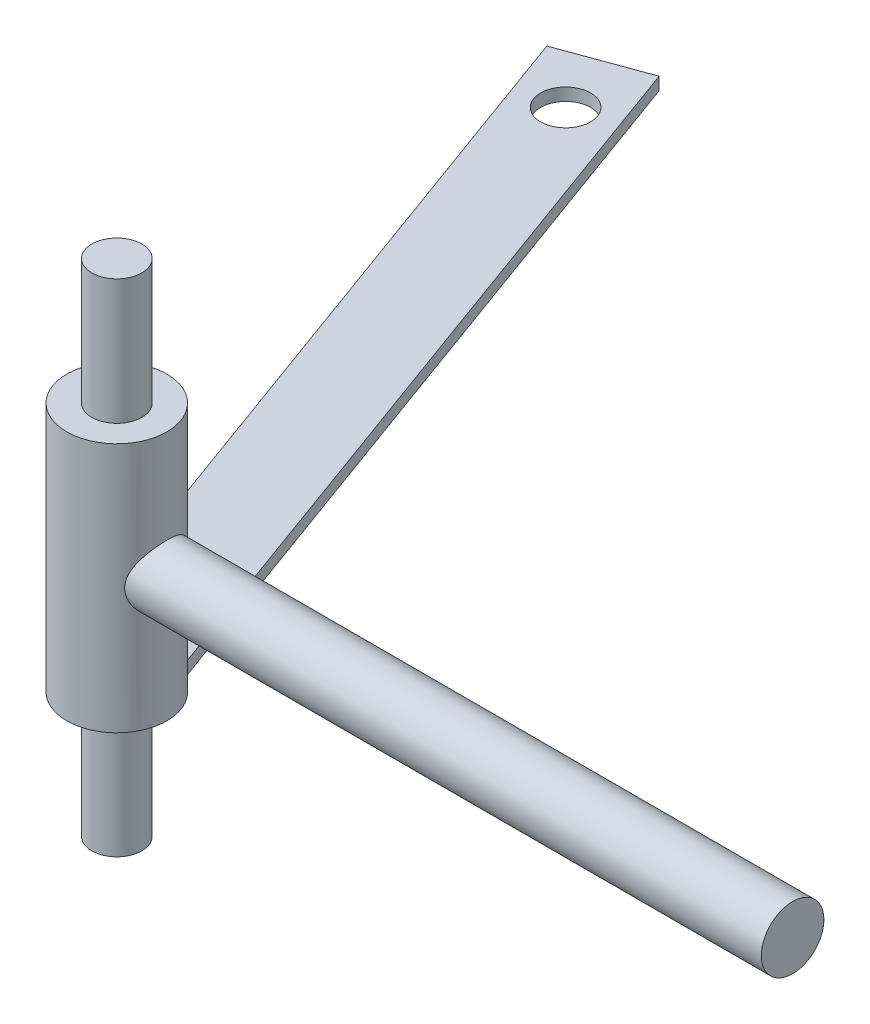
ISO-10303-21;
HEADER;
FILE_DESCRIPTION(('STEP AP214'),'2;1');
FILE_NAME('part.step','',(''),(''),'','','');
FILE_SCHEMA(('AUTOMOTIVE_DESIGN { 1 0 10303 214 1 1 1 1 }'));
ENDSEC;
DATA;
#1=APPLICATION_CONTEXT('core data for automotive mechanical design processes');
#2=APPLICATION_PROTOCOL_DEFINITION('international standard','automotive_design',2000,#1);
#3=PRODUCT_CONTEXT('',#1,'mechanical');
#4=PRODUCT('Part','Part','',(#3));
#5=PRODUCT_RELATED_PRODUCT_CATEGORY('part','',(#4));
#6=PRODUCT_DEFINITION_FORMATION('','',#4);
#7=PRODUCT_DEFINITION_CONTEXT('part definition',#1,'design');
#8=PRODUCT_DEFINITION('design','',#6,#7);
#9=PRODUCT_DEFINITION_SHAPE('','',#8);
#10=(LENGTH_UNIT() NAMED_UNIT(*) SI_UNIT(.MILLI.,.METRE.));
#11=(NAMED_UNIT(*) PLANE_ANGLE_UNIT() SI_UNIT($,.RADIAN.));
#12=(NAMED_UNIT(*) SI_UNIT($,.STERADIAN.) SOLID_ANGLE_UNIT());
#13=UNCERTAINTY_MEASURE_WITH_UNIT(LENGTH_MEASURE(1.E-05),#10,'distance_accuracy_value','');
#14=(GEOMETRIC_REPRESENTATION_CONTEXT(3) GLOBAL_UNCERTAINTY_ASSIGNED_CONTEXT((#13)) GLOBAL_UNIT_ASSIGNED_CONTEXT((#10,
#11,#12)) REPRESENTATION_CONTEXT('',''));
#15=CARTESIAN_POINT('',(0.,0.,0.));
#16=DIRECTION('',(0.,0.,1.));
#17=DIRECTION('',(1.,0.,0.));
#18=AXIS2_PLACEMENT_3D('',#15,#16,#17);
#19=CARTESIAN_POINT('',(0.,20.,0.));
#20=DIRECTION('',(0.,-1.,0.));
#21=DIRECTION('',(0.,0.,-1.));
#22=AXIS2_PLACEMENT_3D('',#19,#20,#21);
#23=CYLINDRICAL_SURFACE('',#22,8.);
#24=CARTESIAN_POINT('',(0.,-18.,0.));
#25=DIRECTION('',(0.,-1.,0.));
#26=DIRECTION('',(0.,0.,-1.));
#27=AXIS2_PLACEMENT_3D('',#24,#25,#26);
#28=CIRCLE('',#27,8.);
#29=CARTESIAN_POINT('',(-7.90248666466915,-18.,-1.24527286757814));
#30=VERTEX_POINT('',#29);
#31=CARTESIAN_POINT('',(5.25321002633356,-18.,-6.03355487413751));
#32=VERTEX_POINT('',#31);
#33=EDGE_CURVE('E51',#30,#32,#28,.T.);
#34=ORIENTED_EDGE('',*,*,#33,.T.);
#35=DIRECTION('',(0.,-1.,0.));
#36=VECTOR('',#35,1.);
#37=CARTESIAN_POINT('',(5.25321002633356,20.,-6.03355487413751));
#38=LINE('',#37,#36);
#39=CARTESIAN_POINT('',(5.25321002633356,-16.,-6.03355487413751));
#40=VERTEX_POINT('',#39);
#41=EDGE_CURVE('E11',#32,#40,#38,.F.);
#42=ORIENTED_EDGE('',*,*,#41,.T.);
#43=CARTESIAN_POINT('',(0.,-16.,0.));
#44=DIRECTION('',(0.,1.,0.));
#45=DIRECTION('',(-1.,0.,0.));
#46=AXIS2_PLACEMENT_3D('',#43,#44,#45);
#47=CIRCLE('',#46,8.);
#48=CARTESIAN_POINT('',(-7.90248666466915,-16.,-1.24527286757812));
#49=VERTEX_POINT('',#48);
#50=EDGE_CURVE('E85',#40,#49,#47,.T.);
#51=ORIENTED_EDGE('',*,*,#50,.T.);
#52=DIRECTION('',(0.,-1.,0.));
#53=VECTOR('',#52,1.);
#54=CARTESIAN_POINT('',(-7.90248666466915,20.,-1.24527286757812));
#55=LINE('',#54,#53);
#56=EDGE_CURVE('E189',#49,#30,#55,.T.);
#57=ORIENTED_EDGE('',*,*,#56,.T.);
#58=EDGE_LOOP('',(#34,#42,#51,#57));
#59=FACE_BOUND('',#58,.T.);
#60=CARTESIAN_POINT('',(0.,20.,0.));
#61=DIRECTION('',(0.,1.,0.));
#62=DIRECTION('',(0.,0.,1.));
#63=AXIS2_PLACEMENT_3D('',#60,#61,#62);
#64=CIRCLE('',#63,8.);
#65=CARTESIAN_POINT('',(0.,20.,8.));
#66=VERTEX_POINT('',#65);
#67=EDGE_CURVE('E119',#66,#66,#64,.T.);
#68=ORIENTED_EDGE('',*,*,#67,.F.);
#69=EDGE_LOOP('',(#68));
#70=FACE_BOUND('',#69,.T.);
#71=CARTESIAN_POINT('',(0.,-20.,0.));
#72=DIRECTION('',(0.,1.,0.));
#73=DIRECTION('',(0.,0.,1.));
#74=AXIS2_PLACEMENT_3D('',#71,#72,#73);
#75=CIRCLE('',#74,8.);
#76=CARTESIAN_POINT('',(0.,-20.,8.));
#77=VERTEX_POINT('',#76);
#78=EDGE_CURVE('E118',#77,#77,#75,.T.);
#79=ORIENTED_EDGE('',*,*,#78,.T.);
#80=EDGE_LOOP('',(#79));
#81=FACE_BOUND('',#80,.T.);
#82=CARTESIAN_POINT('',(6.2449979983984,0.,5.));
#83=CARTESIAN_POINT('',(6.24499999083318,-0.124309997084916,4.99999874728376));
#84=CARTESIAN_POINT('',(6.24872594235153,-0.248643911922182,4.99535477639502));
#85=CARTESIAN_POINT('',(6.26346233698878,-0.49624234521784,4.97686385741702));
#86=CARTESIAN_POINT('',(6.27447707053879,-0.619506190474289,4.96301148892208));
#87=CARTESIAN_POINT('',(6.30332817855701,-0.864132894108489,4.92631685582622));
#88=CARTESIAN_POINT('',(6.32117831167981,-0.985491401070756,4.90345645667282));
#89=CARTESIAN_POINT('',(6.36295500797281,-1.22521846002732,4.84912073775945));
#90=CARTESIAN_POINT('',(6.38688460836052,-1.34358548492504,4.81764111134031));
#91=CARTESIAN_POINT('',(6.46598710467671,-1.69098285176997,4.7115563432738));
#92=CARTESIAN_POINT('',(6.52878844336903,-1.91472159134201,4.6249307188155));
#93=CARTESIAN_POINT('',(6.66732308206754,-2.34407629105235,4.42286683667302));
#94=CARTESIAN_POINT('',(6.74305673480881,-2.54969175663766,4.30742779304936));
#95=CARTESIAN_POINT('',(6.91118002626909,-2.9674414130167,4.03296948836377));
#96=CARTESIAN_POINT('',(7.00444112628932,-3.17674952950574,3.87018134056582));
#97=CARTESIAN_POINT('',(7.19012524520994,-3.5675602565304,3.51319765959103));
#98=CARTESIAN_POINT('',(7.28254746874407,-3.74903864049325,3.31897506071619));
#99=CARTESIAN_POINT('',(7.41988971846401,-4.00760626149244,2.99356128179164));
#100=CARTESIAN_POINT('',(7.46785190700925,-4.09554829341698,2.87212880091628));
#101=CARTESIAN_POINT('',(7.55971876275306,-4.2607595171728,2.62078661715024));
#102=CARTESIAN_POINT('',(7.60362512973126,-4.33803318685166,2.49088050482952));
#103=CARTESIAN_POINT('',(7.68611478127736,-4.48104536831486,2.22333771815377));
#104=CARTESIAN_POINT('',(7.72470066932016,-4.54678952615798,2.08570487145723));
#105=CARTESIAN_POINT('',(7.79539753077303,-4.66588913640084,1.80358193532003));
#106=CARTESIAN_POINT('',(7.82750968154027,-4.71924684175159,1.6590930986712));
#107=CARTESIAN_POINT('',(7.88132879110577,-4.8079574186921,1.37943032429723));
#108=CARTESIAN_POINT('',(7.90376135583819,-4.84458864196752,1.24480106420069));
#109=CARTESIAN_POINT('',(7.94191844310852,-4.90659427549434,0.972050692903698));
#110=CARTESIAN_POINT('',(7.95764407963578,-4.93197055516711,0.833930165626438));
#111=CARTESIAN_POINT('',(7.98191012055643,-4.97102838824165,0.555534462309618));
#112=CARTESIAN_POINT('',(7.9904564434862,-4.98471957483722,0.415261158337185));
#113=CARTESIAN_POINT('',(8.00011955525847,-5.00019508535282,0.133810084943768));
#114=CARTESIAN_POINT('',(8.00123719925945,-5.00198077978344,-0.00736757849820934));
#115=CARTESIAN_POINT('',(7.99636544353032,-4.99418306842006,-0.270239609899376));
#116=CARTESIAN_POINT('',(7.99131217584322,-4.9860972278415,-0.391999310072934));
#117=CARTESIAN_POINT('',(7.97573898833036,-4.96109950689231,-0.63429359230614));
#118=CARTESIAN_POINT('',(7.96521743178982,-4.94418498400023,-0.754827796543429));
#119=CARTESIAN_POINT('',(7.93894787928476,-4.90175195667388,-0.9937504162903));
#120=CARTESIAN_POINT('',(7.92320165200919,-4.8762363638823,-1.11213954368103));
#121=CARTESIAN_POINT('',(7.88683283084566,-4.81691536004192,-1.34607315554106));
#122=CARTESIAN_POINT('',(7.86620835217571,-4.78310674467799,-1.46161652141072));
#123=CARTESIAN_POINT('',(7.79753837345255,-4.66961406787293,-1.80341623892686));
#124=CARTESIAN_POINT('',(7.74273886956257,-4.57793007291278,-2.02447250488061));
#125=CARTESIAN_POINT('',(7.6194209119633,-4.36611560771666,-2.44811588786114));
#126=CARTESIAN_POINT('',(7.55089933332867,-4.24597865675437,-2.6506987826293));
#127=CARTESIAN_POINT('',(7.39573414184525,-3.96389668023518,-3.05883635403528));
#128=CARTESIAN_POINT('',(7.30789649394851,-3.79860933546551,-3.26162345770391));
#129=CARTESIAN_POINT('',(7.12780216070677,-3.43944259665051,-3.63842034253163));
#130=CARTESIAN_POINT('',(7.0355391870356,-3.24552165003414,-3.81238750882611));
#131=CARTESIAN_POINT('',(6.89398778931581,-2.92199806035766,-4.05999923159469));
#132=CARTESIAN_POINT('',(6.84343529038729,-2.80103153254676,-4.14440430037547));
#133=CARTESIAN_POINT('',(6.7450499014227,-2.5512511400869,-4.30267035241461));
#134=CARTESIAN_POINT('',(6.69721752335299,-2.42243580756731,-4.37652935467605));
#135=CARTESIAN_POINT('',(6.60608014442446,-2.15770926568204,-4.51291782494085));
#136=CARTESIAN_POINT('',(6.56276754252838,-2.02181056536115,-4.57546644816391));
#137=CARTESIAN_POINT('',(6.48238923774268,-1.74330768244433,-4.6886516739402));
#138=CARTESIAN_POINT('',(6.44532349757936,-1.60070353986484,-4.7392883475702));
#139=CARTESIAN_POINT('',(6.3879911088914,-1.34808415551627,-4.81614194168603));
#140=CARTESIAN_POINT('',(6.36587062744548,-1.23937010533179,-4.84527833481626));
#141=CARTESIAN_POINT('',(6.3267200135842,-1.01935900201234,-4.89628944573215));
#142=CARTESIAN_POINT('',(6.30968872571675,-0.908062541381968,-4.91816581196151));
#143=CARTESIAN_POINT('',(6.2813224765214,-0.683654493148006,-4.95434333722363));
#144=CARTESIAN_POINT('',(6.26998098512218,-0.570545140796211,-4.96865318123363));
#145=CARTESIAN_POINT('',(6.25339132178237,-0.343158274667134,-4.98951663397229));
#146=CARTESIAN_POINT('',(6.24814339794355,-0.228880713516906,-4.99606992689043));
#147=CARTESIAN_POINT('',(6.24394563972607,0.000213756327469843,-5.00131530513999));
#148=CARTESIAN_POINT('',(6.2450091194138,0.115031294285455,-4.99999077198392));
#149=CARTESIAN_POINT('',(6.25342323341975,0.34411058983996,-4.98946310366481));
#150=CARTESIAN_POINT('',(6.26077617711313,0.458372127783275,-4.98025707456074));
#151=CARTESIAN_POINT('',(6.28148941326477,0.685492435641885,-4.95410620951325));
#152=CARTESIAN_POINT('',(6.29485173090555,0.798350719467862,-4.9371587646522));
#153=CARTESIAN_POINT('',(6.32708655414446,1.02190368194708,-4.8957794498311));
#154=CARTESIAN_POINT('',(6.3459613393153,1.13259744525952,-4.87134448334739));
#155=CARTESIAN_POINT('',(6.40919739263554,1.45674114316006,-4.78821642821574));
#156=CARTESIAN_POINT('',(6.46057720915498,1.6662777271024,-4.71921780239627));
#157=CARTESIAN_POINT('',(6.57662484324882,2.07118631830434,-4.55609149726001));
#158=CARTESIAN_POINT('',(6.6412973751829,2.26655326684989,-4.46195489902188));
#159=CARTESIAN_POINT('',(6.79148506979738,2.67720575477837,-4.23062377482239));
#160=CARTESIAN_POINT('',(6.87862419429458,2.88920195195314,-4.08864375810928));
#161=CARTESIAN_POINT('',(7.05576916354209,3.28876845285956,-3.77473221644168));
#162=CARTESIAN_POINT('',(7.14577790264,3.47631305761312,-3.60276961587649));
#163=CARTESIAN_POINT('',(7.28444679190235,3.75109437385404,-3.30924585333197));
#164=CARTESIAN_POINT('',(7.3346230901993,3.84742308399405,-3.19677534649598));
#165=CARTESIAN_POINT('',(7.43214539316412,4.03023211498251,-2.96297696798608));
#166=CARTESIAN_POINT('',(7.47949245970999,4.11671614194503,-2.84165245789285));
#167=CARTESIAN_POINT('',(7.57009743381039,4.27912544276188,-2.59064393379972));
#168=CARTESIAN_POINT('',(7.61335451021155,4.35504857193848,-2.46095822963468));
#169=CARTESIAN_POINT('',(7.69452475176042,4.49544110368957,-2.19402109584822));
#170=CARTESIAN_POINT('',(7.73244126265916,4.55991768393769,-2.05677447863483));
#171=CARTESIAN_POINT('',(7.79976180045409,4.67313922374355,-1.78389488579443));
#172=CARTESIAN_POINT('',(7.82953658856128,4.72258893611767,-1.64864631402092));
#173=CARTESIAN_POINT('',(7.88249738910155,4.80988250173737,-1.37327166975237));
#174=CARTESIAN_POINT('',(7.90568721484267,4.84773307297854,-1.2331484731144));
#175=CARTESIAN_POINT('',(7.94476970960063,4.91121075887916,-0.949284871547718));
#176=CARTESIAN_POINT('',(7.96066874338032,4.93684853590452,-0.805547737630325));
#177=CARTESIAN_POINT('',(7.98468098207153,4.97547600812264,-0.515747890604359));
#178=CARTESIAN_POINT('',(7.99279547496114,4.98846779564148,-0.369685566273095));
#179=CARTESIAN_POINT('',(8.00036899836203,5.0005918204771,-0.0984542398463481));
#180=CARTESIAN_POINT('',(8.00093085905799,5.00148999709849,0.0266091901107878));
#181=CARTESIAN_POINT('',(7.99619997327325,4.99391869226614,0.276384426548502));
#182=CARTESIAN_POINT('',(7.99090543949389,4.98544635104714,0.401096114033592));
#183=CARTESIAN_POINT('',(7.97459103015405,4.95925462589747,0.649105048465708));
#184=CARTESIAN_POINT('',(7.96357367253312,4.9415393086947,0.772402893113274));
#185=CARTESIAN_POINT('',(7.93607401526798,4.89709863543925,1.01678782002796));
#186=CARTESIAN_POINT('',(7.91958960822669,4.87036980485838,1.13787403075122));
#187=CARTESIAN_POINT('',(7.88220417715129,4.80933512611737,1.3727696067634));
#188=CARTESIAN_POINT('',(7.86147899328625,4.77532902296419,1.486685097437));
#189=CARTESIAN_POINT('',(7.8157172820285,4.69961071566991,1.71105112688166));
#190=CARTESIAN_POINT('',(7.79067928081094,4.65789587685613,1.82150046585626));
#191=CARTESIAN_POINT('',(7.70981708144695,4.52179700785277,2.14674322952902));
#192=CARTESIAN_POINT('',(7.64821482975006,4.41641101660221,2.3556119089249));
#193=CARTESIAN_POINT('',(7.50700801995937,4.1673460340312,2.77466231937412));
#194=CARTESIAN_POINT('',(7.42619858107808,4.02082779517783,2.98273013480178));
#195=CARTESIAN_POINT('',(7.2573471375721,3.6996977630728,3.37285679634255));
#196=CARTESIAN_POINT('',(7.16929702745266,3.52505426989102,3.55488585185797));
#197=CARTESIAN_POINT('',(6.98001614835192,3.12352869133323,3.91489797533942));
#198=CARTESIAN_POINT('',(6.87871489286988,2.89274538552561,4.08851588919805));
#199=CARTESIAN_POINT('',(6.68699282488335,2.40144255795418,4.3950903074783));
#200=CARTESIAN_POINT('',(6.59656601160477,2.14093959230367,4.52806930044201));
#201=CARTESIAN_POINT('',(6.45719150743099,1.65432760274299,4.72397005512007));
#202=CARTESIAN_POINT('',(6.40349524541685,1.43325185965496,4.79586701428079));
#203=CARTESIAN_POINT('',(6.33898756748728,1.09324362690463,4.88041603953431));
#204=CARTESIAN_POINT('',(6.32016868842665,0.978627920072953,4.90470355408434));
#205=CARTESIAN_POINT('',(6.28849738412123,0.747193668970045,4.94524770814465));
#206=CARTESIAN_POINT('',(6.27564188891545,0.630376290428755,4.9615084801139));
#207=CARTESIAN_POINT('',(6.25906589814134,0.427895086979101,4.9823903295282));
#208=CARTESIAN_POINT('',(6.25380210027526,0.342553322442731,4.98898701036639));
#209=CARTESIAN_POINT('',(6.24676702410079,0.171478227136942,4.99779282932784));
#210=CARTESIAN_POINT('',(6.24499662408473,0.0857448033275004,5.00000086408101));
#211=CARTESIAN_POINT('',(6.2449979983984,0.,5.));
#212=B_SPLINE_CURVE_WITH_KNOTS('',3,(#82,#83,#84,#85,#86,#87,#88,#89,#90,#91,#92,#93,#94,#95,
#96,#97,#98,#99,#100,#101,#102,#103,#104,#105,#106,#107,#108,#109,#110,#111,#112,#113,#114,#115,
#116,#117,#118,#119,#120,#121,#122,#123,#124,#125,#126,#127,#128,#129,#130,#131,#132,#133,#134,
#135,#136,#137,#138,#139,#140,#141,#142,#143,#144,#145,#146,#147,#148,#149,#150,#151,#152,#153,
#154,#155,#156,#157,#158,#159,#160,#161,#162,#163,#164,#165,#166,#167,#168,#169,#170,#171,#172,
#173,#174,#175,#176,#177,#178,#179,#180,#181,#182,#183,#184,#185,#186,#187,#188,#189,#190,#191,
#192,#193,#194,#195,#196,#197,#198,#199,#200,#201,#202,#203,#204,#205,#206,#207,#208,#209,#210,
#211),.UNSPECIFIED.,.T.,.F.,(4,2,2,2,2,2,2,2,2,2,2,2,2,2,2,2,2,2,2,2,2,2,2,2,2,2,2,2,2,2,2,2,2,
2,2,2,2,2,2,2,2,2,2,2,2,2,2,2,2,2,2,2,2,2,2,2,2,2,2,2,2,2,2,2,4),(0.,0.372830631717394,
0.745880919988992,1.11968608457865,1.49367836553752,2.2343739724708,2.97508978546025,
3.81517657771247,4.65599058786117,5.1276972709508,5.59920535801266,6.0704818965238,
6.54167264805615,6.9650003716167,7.38825775501684,7.8111658669397,8.2340252946041,
8.59998197802636,8.96604825916241,9.33199074341863,9.69807484639391,10.4313641163756,
11.1648205684642,11.9895533165928,12.8154948839412,13.2827866246025,13.7501660272479,
14.2167463086997,14.6833238060682,15.0271003394338,15.3707987622619,15.7141018213498,
16.0574188576537,16.4014603870609,16.7456282964257,17.0899122787371,17.4343388350078,
18.1111129623981,18.7881275281776,19.5940378131019,20.4007884080993,20.8693475683427,
21.337729748067,21.8062069071061,22.2743892571628,22.7148894158782,23.1551339612148,
23.5949934439159,24.0347801378503,24.409509228706,24.7843527137741,25.1590314139736,
25.5338547106938,25.8954875601863,26.2572442370256,26.9801965139639,27.7781872367985,
28.5770837508034,29.4911341692987,30.4046778558642,31.1173375632652,31.472952845656,
31.8283848529182,32.0854860972178,32.3426519723746),.UNSPECIFIED.);
#213=CARTESIAN_POINT('',(6.2449979983984,0.,5.));
#214=VERTEX_POINT('',#213);
#215=EDGE_CURVE('E134',#214,#214,#212,.T.);
#216=ORIENTED_EDGE('',*,*,#215,.F.);
#217=EDGE_LOOP('',(#216));
#218=FACE_BOUND('',#217,.T.);
#219=ADVANCED_FACE('F43',(#59,#70,#81,#218),#23,.T.);
#220=CARTESIAN_POINT('',(0.,40.,0.));
#221=DIRECTION('',(0.,-1.,0.));
#222=DIRECTION('',(0.,0.,-1.));
#223=AXIS2_PLACEMENT_3D('',#220,#221,#222);
#224=CYLINDRICAL_SURFACE('',#223,4.);
#225=CARTESIAN_POINT('',(0.,20.,0.));
#226=DIRECTION('',(0.,1.,0.));
#227=DIRECTION('',(0.,0.,1.));
#228=AXIS2_PLACEMENT_3D('',#225,#226,#227);
#229=CIRCLE('',#228,4.);
#230=CARTESIAN_POINT('',(0.,20.,4.));
#231=VERTEX_POINT('',#230);
#232=EDGE_CURVE('E122',#231,#231,#229,.T.);
#233=ORIENTED_EDGE('',*,*,#232,.T.);
#234=EDGE_LOOP('',(#233));
#235=FACE_BOUND('',#234,.T.);
#236=CARTESIAN_POINT('',(0.,40.,0.));
#237=DIRECTION('',(0.,1.,0.));
#238=DIRECTION('',(0.,0.,1.));
#239=AXIS2_PLACEMENT_3D('',#236,#237,#238);
#240=CIRCLE('',#239,4.);
#241=CARTESIAN_POINT('',(0.,40.,4.));
#242=VERTEX_POINT('',#241);
#243=EDGE_CURVE('E125',#242,#242,#240,.T.);
#244=ORIENTED_EDGE('',*,*,#243,.F.);
#245=EDGE_LOOP('',(#244));
#246=FACE_BOUND('',#245,.T.);
#247=ADVANCED_FACE('F45',(#235,#246),#224,.T.);
#248=CARTESIAN_POINT('',(0.,40.,0.));
#249=DIRECTION('',(0.,1.,0.));
#250=DIRECTION('',(0.,0.,1.));
#251=AXIS2_PLACEMENT_3D('',#248,#249,#250);
#252=PLANE('',#251);
#253=ORIENTED_EDGE('',*,*,#243,.T.);
#254=EDGE_LOOP('',(#253));
#255=FACE_BOUND('',#254,.T.);
#256=ADVANCED_FACE('F160',(#255),#252,.T.);
#257=CARTESIAN_POINT('',(0.,20.,0.));
#258=DIRECTION('',(0.,1.,0.));
#259=DIRECTION('',(0.,0.,1.));
#260=AXIS2_PLACEMENT_3D('',#257,#258,#259);
#261=PLANE('',#260);
#262=ORIENTED_EDGE('',*,*,#232,.F.);
#263=EDGE_LOOP('',(#262));
#264=FACE_BOUND('',#263,.T.);
#265=ORIENTED_EDGE('',*,*,#67,.T.);
#266=EDGE_LOOP('',(#265));
#267=FACE_BOUND('',#266,.T.);
#268=ADVANCED_FACE('F157',(#264,#267),#261,.T.);
#269=CARTESIAN_POINT('',(0.,-20.,0.));
#270=DIRECTION('',(0.,1.,0.));
#271=DIRECTION('',(0.,0.,1.));
#272=AXIS2_PLACEMENT_3D('',#269,#270,#271);
#273=PLANE('',#272);
#274=CARTESIAN_POINT('',(0.,-20.,0.));
#275=DIRECTION('',(0.,1.,0.));
#276=DIRECTION('',(0.,0.,1.));
#277=AXIS2_PLACEMENT_3D('',#274,#275,#276);
#278=CIRCLE('',#277,4.);
#279=CARTESIAN_POINT('',(0.,-20.,4.));
#280=VERTEX_POINT('',#279);
#281=EDGE_CURVE('E128',#280,#280,#278,.T.);
#282=ORIENTED_EDGE('',*,*,#281,.T.);
#283=EDGE_LOOP('',(#282));
#284=FACE_BOUND('',#283,.T.);
#285=ORIENTED_EDGE('',*,*,#78,.F.);
#286=EDGE_LOOP('',(#285));
#287=FACE_BOUND('',#286,.T.);
#288=ADVANCED_FACE('F159',(#284,#287),#273,.F.);
#289=CARTESIAN_POINT('',(0.,-40.,0.));
#290=DIRECTION('',(0.,1.,0.));
#291=DIRECTION('',(0.,0.,1.));
#292=AXIS2_PLACEMENT_3D('',#289,#290,#291);
#293=PLANE('',#292);
#294=CARTESIAN_POINT('',(0.,-40.,0.));
#295=DIRECTION('',(0.,1.,0.));
#296=DIRECTION('',(0.,0.,1.));
#297=AXIS2_PLACEMENT_3D('',#294,#295,#296);
#298=CIRCLE('',#297,4.);
#299=CARTESIAN_POINT('',(0.,-40.,4.));
#300=VERTEX_POINT('',#299);
#301=EDGE_CURVE('E129',#300,#300,#298,.T.);
#302=ORIENTED_EDGE('',*,*,#301,.F.);
#303=EDGE_LOOP('',(#302));
#304=FACE_BOUND('',#303,.T.);
#305=ADVANCED_FACE('F163',(#304),#293,.F.);
#306=ORIENTED_EDGE('',*,*,#301,.T.);
#307=EDGE_LOOP('',(#306));
#308=FACE_BOUND('',#307,.T.);
#309=ORIENTED_EDGE('',*,*,#281,.F.);
#310=EDGE_LOOP('',(#309));
#311=FACE_BOUND('',#310,.T.);
#312=ADVANCED_FACE('F154',(#308,#311),#224,.T.);
#313=CARTESIAN_POINT('',(108.,0.,0.));
#314=DIRECTION('',(-1.,0.,0.));
#315=DIRECTION('',(0.,0.,1.));
#316=AXIS2_PLACEMENT_3D('',#313,#314,#315);
#317=CYLINDRICAL_SURFACE('',#316,5.);
#318=CARTESIAN_POINT('',(108.,0.,0.));
#319=DIRECTION('',(1.,0.,0.));
#320=DIRECTION('',(0.,0.,-1.));
#321=AXIS2_PLACEMENT_3D('',#318,#319,#320);
#322=CIRCLE('',#321,5.);
#323=CARTESIAN_POINT('',(108.,0.,-5.));
#324=VERTEX_POINT('',#323);
#325=EDGE_CURVE('E111',#324,#324,#322,.T.);
#326=ORIENTED_EDGE('',*,*,#325,.F.);
#327=EDGE_LOOP('',(#326));
#328=FACE_BOUND('',#327,.T.);
#329=ORIENTED_EDGE('',*,*,#215,.T.);
#330=EDGE_LOOP('',(#329));
#331=FACE_BOUND('',#330,.T.);
#332=ADVANCED_FACE('F148',(#328,#331),#317,.T.);
#333=CARTESIAN_POINT('',(108.,0.,0.));
#334=DIRECTION('',(1.,0.,0.));
#335=DIRECTION('',(0.,0.,-1.));
#336=AXIS2_PLACEMENT_3D('',#333,#334,#335);
#337=PLANE('',#336);
#338=ORIENTED_EDGE('',*,*,#325,.T.);
#339=EDGE_LOOP('',(#338));
#340=FACE_BOUND('',#339,.T.);
#341=ADVANCED_FACE('F153',(#340),#337,.T.);
#342=CARTESIAN_POINT('',(-37.8847702868357,-16.,-124.554181705448));
#343=DIRECTION('',(0.939692620785908,0.,-0.342020143325669));
#344=DIRECTION('',(-0.342020143325669,0.,-0.939692620785908));
#345=AXIS2_PLACEMENT_3D('',#342,#343,#344);
#346=PLANE('',#345);
#347=ORIENTED_EDGE('',*,*,#41,.F.);
#348=DIRECTION('',(0.342020143325669,0.,0.939692620785908));
#349=VECTOR('',#348,1.);
#350=CARTESIAN_POINT('',(-37.8847702868357,-18.,-124.554181705448));
#351=LINE('',#350,#349);
#352=CARTESIAN_POINT('',(-37.8847702868357,-18.,-124.554181705448));
#353=VERTEX_POINT('',#352);
#354=EDGE_CURVE('E100',#353,#32,#351,.T.);
#355=ORIENTED_EDGE('',*,*,#354,.F.);
#356=DIRECTION('',(0.,1.,0.));
#357=VECTOR('',#356,1.);
#358=CARTESIAN_POINT('',(-37.8847702868357,-16.,-124.554181705448));
#359=LINE('',#358,#357);
#360=CARTESIAN_POINT('',(-37.8847702868357,-16.,-124.554181705448));
#361=VERTEX_POINT('',#360);
#362=EDGE_CURVE('E94',#353,#361,#359,.T.);
#363=ORIENTED_EDGE('',*,*,#362,.T.);
#364=DIRECTION('',(0.342020143325669,0.,0.939692620785908));
#365=VECTOR('',#364,1.);
#366=CARTESIAN_POINT('',(-37.8847702868357,-16.,-124.554181705448));
#367=LINE('',#366,#365);
#368=EDGE_CURVE('E80',#361,#40,#367,.T.);
#369=ORIENTED_EDGE('',*,*,#368,.T.);
#370=EDGE_LOOP('',(#347,#355,#363,#369));
#371=FACE_BOUND('',#370,.T.);
#372=ADVANCED_FACE('F99',(#371),#346,.T.);
#373=CARTESIAN_POINT('',(-51.0404669778384,-16.,-119.765899698888));
#374=DIRECTION('',(-0.939692620785908,0.,0.342020143325669));
#375=DIRECTION('',(0.342020143325669,0.,0.939692620785908));
#376=AXIS2_PLACEMENT_3D('',#373,#374,#375);
#377=PLANE('',#376);
#378=ORIENTED_EDGE('',*,*,#56,.F.);
#379=DIRECTION('',(0.342020143325669,0.,0.939692620785908));
#380=VECTOR('',#379,1.);
#381=CARTESIAN_POINT('',(-51.0404669778384,-16.,-119.765899698888));
#382=LINE('',#381,#380);
#383=CARTESIAN_POINT('',(-51.0404669778384,-16.,-119.765899698888));
#384=VERTEX_POINT('',#383);
#385=EDGE_CURVE('E58',#384,#49,#382,.T.);
#386=ORIENTED_EDGE('',*,*,#385,.F.);
#387=DIRECTION('',(0.,-1.,0.));
#388=VECTOR('',#387,1.);
#389=CARTESIAN_POINT('',(-51.0404669778384,-16.,-119.765899698888));
#390=LINE('',#389,#388);
#391=CARTESIAN_POINT('',(-51.0404669778384,-18.,-119.765899698888));
#392=VERTEX_POINT('',#391);
#393=EDGE_CURVE('E97',#384,#392,#390,.T.);
#394=ORIENTED_EDGE('',*,*,#393,.T.);
#395=DIRECTION('',(0.342020143325669,0.,0.939692620785908));
#396=VECTOR('',#395,1.);
#397=CARTESIAN_POINT('',(-51.0404669778384,-18.,-119.765899698888));
#398=LINE('',#397,#396);
#399=EDGE_CURVE('E112',#392,#30,#398,.T.);
#400=ORIENTED_EDGE('',*,*,#399,.T.);
#401=EDGE_LOOP('',(#378,#386,#394,#400));
#402=FACE_BOUND('',#401,.T.);
#403=ADVANCED_FACE('F193',(#402),#377,.T.);
#404=CARTESIAN_POINT('',(-51.0404669778384,-18.,-119.765899698888));
#405=DIRECTION('',(0.,-1.,0.));
#406=DIRECTION('',(0.,0.,-1.));
#407=AXIS2_PLACEMENT_3D('',#404,#405,#406);
#408=PLANE('',#407);
#409=CARTESIAN_POINT('',(-41.0424171990803,-18.,-112.763114494309));
#410=DIRECTION('',(0.,-1.,0.));
#411=DIRECTION('',(0.,0.,-1.));
#412=AXIS2_PLACEMENT_3D('',#409,#410,#411);
#413=CIRCLE('',#412,4.00000000000001);
#414=CARTESIAN_POINT('',(-41.0424171990803,-18.,-116.763114494309));
#415=VERTEX_POINT('',#414);
#416=EDGE_CURVE('E104',#415,#415,#413,.F.);
#417=ORIENTED_EDGE('',*,*,#416,.T.);
#418=EDGE_LOOP('',(#417));
#419=FACE_BOUND('',#418,.T.);
#420=ORIENTED_EDGE('',*,*,#33,.F.);
#421=ORIENTED_EDGE('',*,*,#399,.F.);
#422=DIRECTION('',(0.939692620785908,0.,-0.342020143325669));
#423=VECTOR('',#422,1.);
#424=CARTESIAN_POINT('',(-51.0404669778384,-18.,-119.765899698888));
#425=LINE('',#424,#423);
#426=EDGE_CURVE('E87',#392,#353,#425,.T.);
#427=ORIENTED_EDGE('',*,*,#426,.T.);
#428=ORIENTED_EDGE('',*,*,#354,.T.);
#429=EDGE_LOOP('',(#420,#421,#427,#428));
#430=FACE_BOUND('',#429,.T.);
#431=ADVANCED_FACE('F191',(#419,#430),#408,.T.);
#432=CARTESIAN_POINT('',(-51.0404669778384,-16.,-119.765899698888));
#433=DIRECTION('',(0.,1.,0.));
#434=DIRECTION('',(-1.,0.,0.));
#435=AXIS2_PLACEMENT_3D('',#432,#433,#434);
#436=PLANE('',#435);
#437=CARTESIAN_POINT('',(-41.0424171990803,-16.,-112.763114494309));
#438=DIRECTION('',(0.,1.,0.));
#439=DIRECTION('',(-1.,0.,0.));
#440=AXIS2_PLACEMENT_3D('',#437,#438,#439);
#441=CIRCLE('',#440,4.00000000000001);
#442=CARTESIAN_POINT('',(-45.0424171990803,-16.,-112.763114494309));
#443=VERTEX_POINT('',#442);
#444=EDGE_CURVE('E101',#443,#443,#441,.T.);
#445=ORIENTED_EDGE('',*,*,#444,.F.);
#446=EDGE_LOOP('',(#445));
#447=FACE_BOUND('',#446,.T.);
#448=ORIENTED_EDGE('',*,*,#50,.F.);
#449=ORIENTED_EDGE('',*,*,#368,.F.);
#450=DIRECTION('',(-0.939692620785908,0.,0.342020143325669));
#451=VECTOR('',#450,1.);
#452=CARTESIAN_POINT('',(-51.0404669778384,-16.,-119.765899698888));
#453=LINE('',#452,#451);
#454=EDGE_CURVE('E83',#361,#384,#453,.T.);
#455=ORIENTED_EDGE('',*,*,#454,.T.);
#456=ORIENTED_EDGE('',*,*,#385,.T.);
#457=EDGE_LOOP('',(#448,#449,#455,#456));
#458=FACE_BOUND('',#457,.T.);
#459=ADVANCED_FACE('F82',(#447,#458),#436,.T.);
#460=CARTESIAN_POINT('',(-44.462618632337,0.,-122.160040702168));
#461=DIRECTION('',(0.342020143325669,0.,0.939692620785908));
#462=DIRECTION('',(0.939692620785908,0.,-0.342020143325669));
#463=AXIS2_PLACEMENT_3D('',#460,#461,#462);
#464=PLANE('',#463);
#465=ORIENTED_EDGE('',*,*,#362,.F.);
#466=ORIENTED_EDGE('',*,*,#426,.F.);
#467=ORIENTED_EDGE('',*,*,#393,.F.);
#468=ORIENTED_EDGE('',*,*,#454,.F.);
#469=EDGE_LOOP('',(#465,#466,#467,#468));
#470=FACE_BOUND('',#469,.T.);
#471=ADVANCED_FACE('F92',(#470),#464,.F.);
#472=CARTESIAN_POINT('',(-41.0424171990803,-40.001,-112.763114494309));
#473=DIRECTION('',(0.,1.,0.));
#474=DIRECTION('',(-1.,0.,0.));
#475=AXIS2_PLACEMENT_3D('',#472,#473,#474);
#476=CYLINDRICAL_SURFACE('',#475,4.00000000000001);
#477=ORIENTED_EDGE('',*,*,#416,.F.);
#478=EDGE_LOOP('',(#477));
#479=FACE_BOUND('',#478,.T.);
#480=ORIENTED_EDGE('',*,*,#444,.T.);
#481=EDGE_LOOP('',(#480));
#482=FACE_BOUND('',#481,.T.);
#483=ADVANCED_FACE('F209',(#479,#482),#476,.F.);
#484=CLOSED_SHELL('',(#219,#247,#256,#268,#288,#305,#312,#332,#341,#372,#403,#431,#459,#471,#483));
#485=MANIFOLD_SOLID_BREP('B2',#484);
#486=ADVANCED_BREP_SHAPE_REPRESENTATION('',(#18,#485),#14);
#487=SHAPE_DEFINITION_REPRESENTATION(#9,#486);
ENDSEC;
END-ISO-10303-21;
